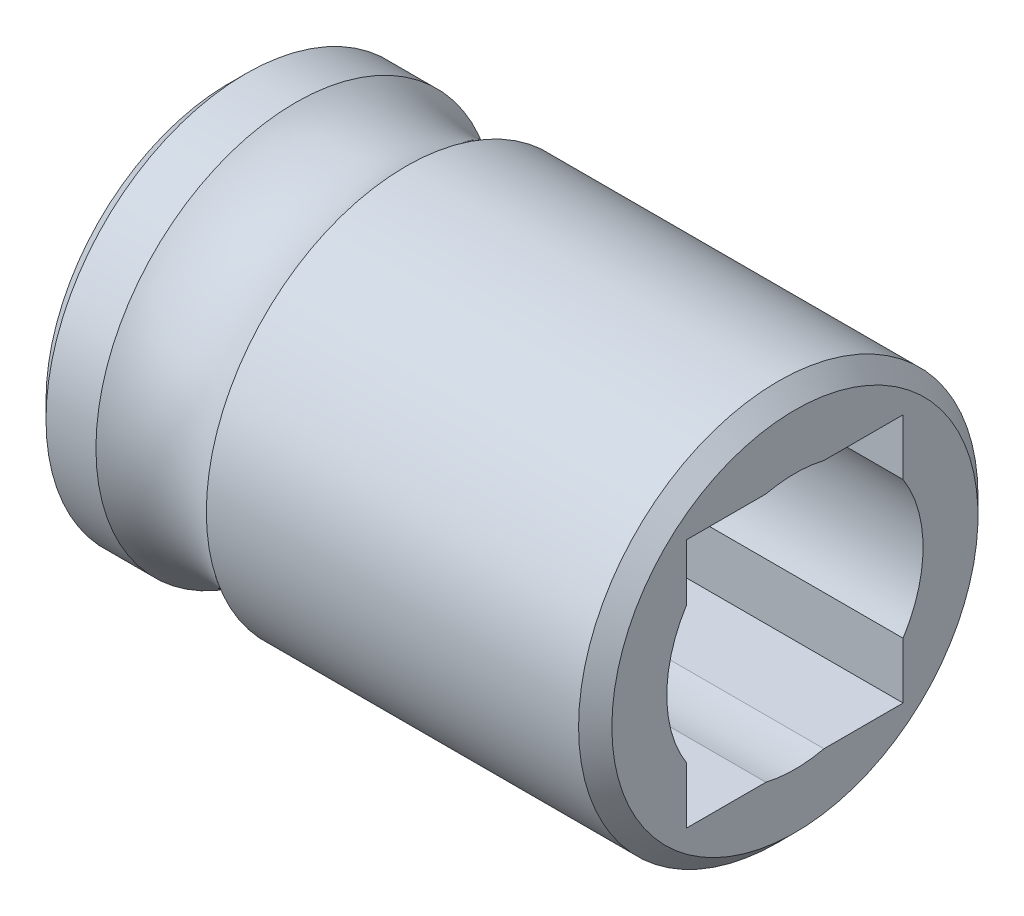
ISO-10303-21;
HEADER;
FILE_DESCRIPTION(('STEP AP214'),'2;1');
FILE_NAME('part.step','',(''),(''),'','','');
FILE_SCHEMA(('AUTOMOTIVE_DESIGN { 1 0 10303 214 1 1 1 1 }'));
ENDSEC;
DATA;
#1=APPLICATION_CONTEXT('core data for automotive mechanical design processes');
#2=APPLICATION_PROTOCOL_DEFINITION('international standard','automotive_design',2000,#1);
#3=PRODUCT_CONTEXT('',#1,'mechanical');
#4=PRODUCT('Part','Part','',(#3));
#5=PRODUCT_RELATED_PRODUCT_CATEGORY('part','',(#4));
#6=PRODUCT_DEFINITION_FORMATION('','',#4);
#7=PRODUCT_DEFINITION_CONTEXT('part definition',#1,'design');
#8=PRODUCT_DEFINITION('design','',#6,#7);
#9=PRODUCT_DEFINITION_SHAPE('','',#8);
#10=(LENGTH_UNIT() NAMED_UNIT(*) SI_UNIT(.MILLI.,.METRE.));
#11=(NAMED_UNIT(*) PLANE_ANGLE_UNIT() SI_UNIT($,.RADIAN.));
#12=(NAMED_UNIT(*) SI_UNIT($,.STERADIAN.) SOLID_ANGLE_UNIT());
#13=UNCERTAINTY_MEASURE_WITH_UNIT(LENGTH_MEASURE(1.E-05),#10,'distance_accuracy_value','');
#14=(GEOMETRIC_REPRESENTATION_CONTEXT(3) GLOBAL_UNCERTAINTY_ASSIGNED_CONTEXT((#13)) GLOBAL_UNIT_ASSIGNED_CONTEXT((#10,
#11,#12)) REPRESENTATION_CONTEXT('',''));
#15=CARTESIAN_POINT('',(0.,0.,0.));
#16=DIRECTION('',(0.,0.,1.));
#17=DIRECTION('',(1.,0.,0.));
#18=AXIS2_PLACEMENT_3D('',#15,#16,#17);
#19=CARTESIAN_POINT('',(-34.7505494505494,0.,0.));
#20=DIRECTION('',(-1.,0.,0.));
#21=DIRECTION('',(0.,0.,1.));
#22=AXIS2_PLACEMENT_3D('',#19,#20,#21);
#23=CYLINDRICAL_SURFACE('',#22,3.85);
#24=CARTESIAN_POINT('',(-17.,0.,0.));
#25=DIRECTION('',(-1.,0.,0.));
#26=DIRECTION('',(0.,0.,1.));
#27=AXIS2_PLACEMENT_3D('',#24,#25,#26);
#28=CIRCLE('',#27,3.85);
#29=CARTESIAN_POINT('',(-17.,-2.06397674405503,3.25));
#30=VERTEX_POINT('',#29);
#31=CARTESIAN_POINT('',(-17.,2.06397674405503,3.25));
#32=VERTEX_POINT('',#31);
#33=EDGE_CURVE('E509',#30,#32,#28,.T.);
#34=ORIENTED_EDGE('',*,*,#33,.T.);
#35=DIRECTION('',(-1.,0.,0.));
#36=VECTOR('',#35,1.);
#37=CARTESIAN_POINT('',(-34.7505494505494,2.06397674405503,3.25));
#38=LINE('',#37,#36);
#39=CARTESIAN_POINT('',(0.,2.06397674405503,3.25));
#40=VERTEX_POINT('',#39);
#41=EDGE_CURVE('E506',#32,#40,#38,.F.);
#42=ORIENTED_EDGE('',*,*,#41,.T.);
#43=CARTESIAN_POINT('',(0.,0.,0.));
#44=DIRECTION('',(-1.,0.,0.));
#45=DIRECTION('',(0.,0.,1.));
#46=AXIS2_PLACEMENT_3D('',#43,#44,#45);
#47=CIRCLE('',#46,3.85);
#48=CARTESIAN_POINT('',(0.,-2.06397674405503,3.25));
#49=VERTEX_POINT('',#48);
#50=EDGE_CURVE('E532',#49,#40,#47,.T.);
#51=ORIENTED_EDGE('',*,*,#50,.F.);
#52=DIRECTION('',(-1.,0.,0.));
#53=VECTOR('',#52,1.);
#54=CARTESIAN_POINT('',(-34.7505494505494,-2.06397674405503,3.25));
#55=LINE('',#54,#53);
#56=EDGE_CURVE('E446',#49,#30,#55,.T.);
#57=ORIENTED_EDGE('',*,*,#56,.T.);
#58=EDGE_LOOP('',(#34,#42,#51,#57));
#59=FACE_BOUND('',#58,.T.);
#60=ADVANCED_FACE('F350',(#59),#23,.F.);
#61=CARTESIAN_POINT('',(-17.,3.75,0.871779788708133));
#62=VERTEX_POINT('',#61);
#63=CARTESIAN_POINT('',(-17.,3.75,-0.871779788708131));
#64=VERTEX_POINT('',#63);
#65=EDGE_CURVE('E513',#62,#64,#28,.T.);
#66=ORIENTED_EDGE('',*,*,#65,.T.);
#67=DIRECTION('',(-1.,0.,0.));
#68=VECTOR('',#67,1.);
#69=CARTESIAN_POINT('',(-34.7505494505494,3.75,-0.871779788708133));
#70=LINE('',#69,#68);
#71=CARTESIAN_POINT('',(0.,3.75,-0.871779788708131));
#72=VERTEX_POINT('',#71);
#73=EDGE_CURVE('E502',#64,#72,#70,.F.);
#74=ORIENTED_EDGE('',*,*,#73,.T.);
#75=CARTESIAN_POINT('',(0.,3.75,0.871779788708133));
#76=VERTEX_POINT('',#75);
#77=EDGE_CURVE('E534',#76,#72,#47,.T.);
#78=ORIENTED_EDGE('',*,*,#77,.F.);
#79=DIRECTION('',(-1.,0.,0.));
#80=VECTOR('',#79,1.);
#81=CARTESIAN_POINT('',(-34.7505494505494,3.75,0.871779788708132));
#82=LINE('',#81,#80);
#83=EDGE_CURVE('E499',#76,#62,#82,.T.);
#84=ORIENTED_EDGE('',*,*,#83,.T.);
#85=EDGE_LOOP('',(#66,#74,#78,#84));
#86=FACE_BOUND('',#85,.T.);
#87=ADVANCED_FACE('F573',(#86),#23,.F.);
#88=CARTESIAN_POINT('',(-17.,2.06397674405503,-3.25));
#89=VERTEX_POINT('',#88);
#90=CARTESIAN_POINT('',(-17.,-2.06397674405503,-3.25));
#91=VERTEX_POINT('',#90);
#92=EDGE_CURVE('E557',#89,#91,#28,.T.);
#93=ORIENTED_EDGE('',*,*,#92,.T.);
#94=DIRECTION('',(-1.,0.,0.));
#95=VECTOR('',#94,1.);
#96=CARTESIAN_POINT('',(-34.7505494505494,-2.06397674405503,-3.25));
#97=LINE('',#96,#95);
#98=CARTESIAN_POINT('',(0.,-2.06397674405503,-3.25));
#99=VERTEX_POINT('',#98);
#100=EDGE_CURVE('E496',#91,#99,#97,.F.);
#101=ORIENTED_EDGE('',*,*,#100,.T.);
#102=CARTESIAN_POINT('',(0.,2.06397674405503,-3.25));
#103=VERTEX_POINT('',#102);
#104=EDGE_CURVE('E571',#103,#99,#47,.T.);
#105=ORIENTED_EDGE('',*,*,#104,.F.);
#106=DIRECTION('',(-1.,0.,0.));
#107=VECTOR('',#106,1.);
#108=CARTESIAN_POINT('',(-34.7505494505494,2.06397674405503,-3.25));
#109=LINE('',#108,#107);
#110=EDGE_CURVE('E493',#103,#89,#109,.T.);
#111=ORIENTED_EDGE('',*,*,#110,.T.);
#112=EDGE_LOOP('',(#93,#101,#105,#111));
#113=FACE_BOUND('',#112,.T.);
#114=ADVANCED_FACE('F577',(#113),#23,.F.);
#115=CARTESIAN_POINT('',(-17.,-3.75,-0.871779788708135));
#116=VERTEX_POINT('',#115);
#117=CARTESIAN_POINT('',(-17.,-3.75,0.871779788708135));
#118=VERTEX_POINT('',#117);
#119=EDGE_CURVE('E512',#116,#118,#28,.T.);
#120=ORIENTED_EDGE('',*,*,#119,.T.);
#121=DIRECTION('',(-1.,0.,0.));
#122=VECTOR('',#121,1.);
#123=CARTESIAN_POINT('',(-34.7505494505494,-3.75,0.871779788708137));
#124=LINE('',#123,#122);
#125=CARTESIAN_POINT('',(0.,-3.75,0.871779788708139));
#126=VERTEX_POINT('',#125);
#127=EDGE_CURVE('E491',#118,#126,#124,.F.);
#128=ORIENTED_EDGE('',*,*,#127,.T.);
#129=CARTESIAN_POINT('',(0.,-3.75,-0.87177978870814));
#130=VERTEX_POINT('',#129);
#131=EDGE_CURVE('E466',#130,#126,#47,.T.);
#132=ORIENTED_EDGE('',*,*,#131,.F.);
#133=DIRECTION('',(-1.,0.,0.));
#134=VECTOR('',#133,1.);
#135=CARTESIAN_POINT('',(-34.7505494505494,-3.75,-0.871779788708137));
#136=LINE('',#135,#134);
#137=EDGE_CURVE('E484',#130,#116,#136,.T.);
#138=ORIENTED_EDGE('',*,*,#137,.T.);
#139=EDGE_LOOP('',(#120,#128,#132,#138));
#140=FACE_BOUND('',#139,.T.);
#141=ADVANCED_FACE('F352',(#140),#23,.F.);
#142=CARTESIAN_POINT('',(0.,3.85,0.));
#143=DIRECTION('',(-1.,0.,0.));
#144=DIRECTION('',(0.,0.,1.));
#145=AXIS2_PLACEMENT_3D('',#142,#143,#144);
#146=PLANE('',#145);
#147=CARTESIAN_POINT('',(0.,0.,0.));
#148=DIRECTION('',(-1.,0.,0.));
#149=DIRECTION('',(0.,0.,1.));
#150=AXIS2_PLACEMENT_3D('',#147,#148,#149);
#151=CIRCLE('',#150,5.5);
#152=CARTESIAN_POINT('',(0.,0.,5.5));
#153=VERTEX_POINT('',#152);
#154=EDGE_CURVE('E529',#153,#153,#151,.T.);
#155=ORIENTED_EDGE('',*,*,#154,.F.);
#156=EDGE_LOOP('',(#155));
#157=FACE_BOUND('',#156,.T.);
#158=ORIENTED_EDGE('',*,*,#50,.T.);
#159=DIRECTION('',(0.,-1.,0.));
#160=VECTOR('',#159,1.);
#161=CARTESIAN_POINT('',(0.,-3.75,3.25));
#162=LINE('',#161,#160);
#163=CARTESIAN_POINT('',(0.,3.75,3.25));
#164=VERTEX_POINT('',#163);
#165=EDGE_CURVE('E451',#164,#40,#162,.T.);
#166=ORIENTED_EDGE('',*,*,#165,.F.);
#167=DIRECTION('',(0.,0.,1.));
#168=VECTOR('',#167,1.);
#169=CARTESIAN_POINT('',(0.,3.75,3.25));
#170=LINE('',#169,#168);
#171=EDGE_CURVE('E473',#76,#164,#170,.T.);
#172=ORIENTED_EDGE('',*,*,#171,.F.);
#173=ORIENTED_EDGE('',*,*,#77,.T.);
#174=CARTESIAN_POINT('',(0.,3.75,-3.25));
#175=VERTEX_POINT('',#174);
#176=EDGE_CURVE('E474',#175,#72,#170,.T.);
#177=ORIENTED_EDGE('',*,*,#176,.F.);
#178=DIRECTION('',(0.,1.,0.));
#179=VECTOR('',#178,1.);
#180=CARTESIAN_POINT('',(0.,-3.75,-3.25));
#181=LINE('',#180,#179);
#182=EDGE_CURVE('E467',#103,#175,#181,.T.);
#183=ORIENTED_EDGE('',*,*,#182,.F.);
#184=ORIENTED_EDGE('',*,*,#104,.T.);
#185=CARTESIAN_POINT('',(0.,-3.75,-3.25));
#186=VERTEX_POINT('',#185);
#187=EDGE_CURVE('E470',#186,#99,#181,.T.);
#188=ORIENTED_EDGE('',*,*,#187,.F.);
#189=DIRECTION('',(0.,0.,-1.));
#190=VECTOR('',#189,1.);
#191=CARTESIAN_POINT('',(0.,-3.75,3.25));
#192=LINE('',#191,#190);
#193=EDGE_CURVE('E468',#130,#186,#192,.T.);
#194=ORIENTED_EDGE('',*,*,#193,.F.);
#195=ORIENTED_EDGE('',*,*,#131,.T.);
#196=CARTESIAN_POINT('',(0.,-3.75,3.25));
#197=VERTEX_POINT('',#196);
#198=EDGE_CURVE('E455',#197,#126,#192,.T.);
#199=ORIENTED_EDGE('',*,*,#198,.F.);
#200=EDGE_CURVE('E440',#49,#197,#162,.T.);
#201=ORIENTED_EDGE('',*,*,#200,.F.);
#202=EDGE_LOOP('',(#158,#166,#172,#173,#177,#183,#184,#188,#194,#195,#199,#201));
#203=FACE_BOUND('',#202,.T.);
#204=ADVANCED_FACE('F463',(#157,#203),#146,.F.);
#205=CARTESIAN_POINT('',(0.,0.,0.));
#206=DIRECTION('',(-1.,0.,0.));
#207=DIRECTION('',(0.,0.,1.));
#208=AXIS2_PLACEMENT_3D('',#205,#206,#207);
#209=CONICAL_SURFACE('',#208,5.5,0.785398163397448);
#210=CARTESIAN_POINT('',(-0.5,0.,0.));
#211=DIRECTION('',(-1.,0.,0.));
#212=DIRECTION('',(0.,0.,1.));
#213=AXIS2_PLACEMENT_3D('',#210,#211,#212);
#214=CIRCLE('',#213,6.);
#215=CARTESIAN_POINT('',(-0.5,0.,6.));
#216=VERTEX_POINT('',#215);
#217=EDGE_CURVE('E526',#216,#216,#214,.T.);
#218=ORIENTED_EDGE('',*,*,#217,.F.);
#219=EDGE_LOOP('',(#218));
#220=FACE_BOUND('',#219,.T.);
#221=ORIENTED_EDGE('',*,*,#154,.T.);
#222=EDGE_LOOP('',(#221));
#223=FACE_BOUND('',#222,.T.);
#224=ADVANCED_FACE('F633',(#220,#223),#209,.T.);
#225=CARTESIAN_POINT('',(-34.7505494505494,0.,0.));
#226=DIRECTION('',(-1.,0.,0.));
#227=DIRECTION('',(0.,0.,1.));
#228=AXIS2_PLACEMENT_3D('',#225,#226,#227);
#229=CYLINDRICAL_SURFACE('',#228,6.);
#230=CARTESIAN_POINT('',(-11.6833752096446,0.,0.));
#231=DIRECTION('',(-1.,0.,0.));
#232=DIRECTION('',(0.,0.,1.));
#233=AXIS2_PLACEMENT_3D('',#230,#231,#232);
#234=CIRCLE('',#233,6.);
#235=CARTESIAN_POINT('',(-11.6833752096446,0.,6.));
#236=VERTEX_POINT('',#235);
#237=EDGE_CURVE('E523',#236,#236,#234,.T.);
#238=ORIENTED_EDGE('',*,*,#237,.F.);
#239=EDGE_LOOP('',(#238));
#240=FACE_BOUND('',#239,.T.);
#241=ORIENTED_EDGE('',*,*,#217,.T.);
#242=EDGE_LOOP('',(#241));
#243=FACE_BOUND('',#242,.T.);
#244=ADVANCED_FACE('F625',(#240,#243),#229,.T.);
#245=CARTESIAN_POINT('',(-13.3416876048223,0.,0.));
#246=DIRECTION('',(-1.,0.,0.));
#247=DIRECTION('',(0.,0.,1.));
#248=AXIS2_PLACEMENT_3D('',#245,#246,#247);
#249=TOROIDAL_SURFACE('',#248,8.5,3.);
#250=CARTESIAN_POINT('',(-15.,0.,0.));
#251=DIRECTION('',(-1.,0.,0.));
#252=DIRECTION('',(0.,0.,1.));
#253=AXIS2_PLACEMENT_3D('',#250,#251,#252);
#254=CIRCLE('',#253,6.);
#255=CARTESIAN_POINT('',(-15.,0.,6.));
#256=VERTEX_POINT('',#255);
#257=EDGE_CURVE('E520',#256,#256,#254,.T.);
#258=ORIENTED_EDGE('',*,*,#257,.F.);
#259=EDGE_LOOP('',(#258));
#260=FACE_BOUND('',#259,.T.);
#261=ORIENTED_EDGE('',*,*,#237,.T.);
#262=EDGE_LOOP('',(#261));
#263=FACE_BOUND('',#262,.T.);
#264=ADVANCED_FACE('F617',(#260,#263),#249,.F.);
#265=CARTESIAN_POINT('',(-34.7505494505494,0.,0.));
#266=DIRECTION('',(-1.,0.,0.));
#267=DIRECTION('',(0.,0.,1.));
#268=AXIS2_PLACEMENT_3D('',#265,#266,#267);
#269=CYLINDRICAL_SURFACE('',#268,6.);
#270=CARTESIAN_POINT('',(-16.5,0.,0.));
#271=DIRECTION('',(-1.,0.,0.));
#272=DIRECTION('',(0.,0.,1.));
#273=AXIS2_PLACEMENT_3D('',#270,#271,#272);
#274=CIRCLE('',#273,6.);
#275=CARTESIAN_POINT('',(-16.5,0.,6.));
#276=VERTEX_POINT('',#275);
#277=EDGE_CURVE('E517',#276,#276,#274,.T.);
#278=ORIENTED_EDGE('',*,*,#277,.F.);
#279=EDGE_LOOP('',(#278));
#280=FACE_BOUND('',#279,.T.);
#281=ORIENTED_EDGE('',*,*,#257,.T.);
#282=EDGE_LOOP('',(#281));
#283=FACE_BOUND('',#282,.T.);
#284=ADVANCED_FACE('F611',(#280,#283),#269,.T.);
#285=CARTESIAN_POINT('',(-16.5,0.,0.));
#286=DIRECTION('',(1.,0.,0.));
#287=DIRECTION('',(0.,0.,-1.));
#288=AXIS2_PLACEMENT_3D('',#285,#286,#287);
#289=CONICAL_SURFACE('',#288,6.,0.785398163397448);
#290=CARTESIAN_POINT('',(-17.,0.,0.));
#291=DIRECTION('',(-1.,0.,0.));
#292=DIRECTION('',(0.,0.,1.));
#293=AXIS2_PLACEMENT_3D('',#290,#291,#292);
#294=CIRCLE('',#293,5.5);
#295=CARTESIAN_POINT('',(-17.,0.,5.5));
#296=VERTEX_POINT('',#295);
#297=EDGE_CURVE('E514',#296,#296,#294,.T.);
#298=ORIENTED_EDGE('',*,*,#297,.F.);
#299=EDGE_LOOP('',(#298));
#300=FACE_BOUND('',#299,.T.);
#301=ORIENTED_EDGE('',*,*,#277,.T.);
#302=EDGE_LOOP('',(#301));
#303=FACE_BOUND('',#302,.T.);
#304=ADVANCED_FACE('F591',(#300,#303),#289,.T.);
#305=CARTESIAN_POINT('',(-17.,5.5,0.));
#306=DIRECTION('',(1.,0.,0.));
#307=DIRECTION('',(0.,0.,-1.));
#308=AXIS2_PLACEMENT_3D('',#305,#306,#307);
#309=PLANE('',#308);
#310=DIRECTION('',(0.,0.,1.));
#311=VECTOR('',#310,1.);
#312=CARTESIAN_POINT('',(-17.,3.75,0.));
#313=LINE('',#312,#311);
#314=CARTESIAN_POINT('',(-17.,3.75,3.25));
#315=VERTEX_POINT('',#314);
#316=EDGE_CURVE('E11',#62,#315,#313,.T.);
#317=ORIENTED_EDGE('',*,*,#316,.T.);
#318=DIRECTION('',(0.,-1.,0.));
#319=VECTOR('',#318,1.);
#320=CARTESIAN_POINT('',(-17.,-3.75,3.25));
#321=LINE('',#320,#319);
#322=EDGE_CURVE('E365',#315,#32,#321,.T.);
#323=ORIENTED_EDGE('',*,*,#322,.T.);
#324=ORIENTED_EDGE('',*,*,#33,.F.);
#325=DIRECTION('',(0.,-1.,0.));
#326=VECTOR('',#325,1.);
#327=CARTESIAN_POINT('',(-17.,5.5,3.25));
#328=LINE('',#327,#326);
#329=CARTESIAN_POINT('',(-17.,-3.75,3.25));
#330=VERTEX_POINT('',#329);
#331=EDGE_CURVE('E538',#30,#330,#328,.T.);
#332=ORIENTED_EDGE('',*,*,#331,.T.);
#333=DIRECTION('',(0.,0.,-1.));
#334=VECTOR('',#333,1.);
#335=CARTESIAN_POINT('',(-17.,-3.75,3.25));
#336=LINE('',#335,#334);
#337=EDGE_CURVE('E458',#330,#118,#336,.T.);
#338=ORIENTED_EDGE('',*,*,#337,.T.);
#339=ORIENTED_EDGE('',*,*,#119,.F.);
#340=DIRECTION('',(0.,0.,-1.));
#341=VECTOR('',#340,1.);
#342=CARTESIAN_POINT('',(-17.,-3.75,0.));
#343=LINE('',#342,#341);
#344=CARTESIAN_POINT('',(-17.,-3.75,-3.25));
#345=VERTEX_POINT('',#344);
#346=EDGE_CURVE('E535',#116,#345,#343,.T.);
#347=ORIENTED_EDGE('',*,*,#346,.T.);
#348=DIRECTION('',(0.,1.,0.));
#349=VECTOR('',#348,1.);
#350=CARTESIAN_POINT('',(-17.,-3.75,-3.25));
#351=LINE('',#350,#349);
#352=EDGE_CURVE('E478',#345,#91,#351,.T.);
#353=ORIENTED_EDGE('',*,*,#352,.T.);
#354=ORIENTED_EDGE('',*,*,#92,.F.);
#355=DIRECTION('',(0.,1.,0.));
#356=VECTOR('',#355,1.);
#357=CARTESIAN_POINT('',(-17.,5.5,-3.25));
#358=LINE('',#357,#356);
#359=CARTESIAN_POINT('',(-17.,3.75,-3.25));
#360=VERTEX_POINT('',#359);
#361=EDGE_CURVE('E358',#89,#360,#358,.T.);
#362=ORIENTED_EDGE('',*,*,#361,.T.);
#363=DIRECTION('',(0.,0.,1.));
#364=VECTOR('',#363,1.);
#365=CARTESIAN_POINT('',(-17.,3.75,3.25));
#366=LINE('',#365,#364);
#367=EDGE_CURVE('E373',#360,#64,#366,.T.);
#368=ORIENTED_EDGE('',*,*,#367,.T.);
#369=ORIENTED_EDGE('',*,*,#65,.F.);
#370=EDGE_LOOP('',(#317,#323,#324,#332,#338,#339,#347,#353,#354,#362,#368,#369));
#371=FACE_BOUND('',#370,.T.);
#372=ORIENTED_EDGE('',*,*,#297,.T.);
#373=EDGE_LOOP('',(#372));
#374=FACE_BOUND('',#373,.T.);
#375=ADVANCED_FACE('F542',(#371,#374),#309,.F.);
#376=CARTESIAN_POINT('',(-17.,-3.75,3.25));
#377=DIRECTION('',(0.,-1.,0.));
#378=DIRECTION('',(0.,0.,-1.));
#379=AXIS2_PLACEMENT_3D('',#376,#377,#378);
#380=PLANE('',#379);
#381=ORIENTED_EDGE('',*,*,#193,.T.);
#382=DIRECTION('',(1.,0.,0.));
#383=VECTOR('',#382,1.);
#384=CARTESIAN_POINT('',(-17.,-3.75,-3.25));
#385=LINE('',#384,#383);
#386=EDGE_CURVE('E460',#345,#186,#385,.T.);
#387=ORIENTED_EDGE('',*,*,#386,.F.);
#388=ORIENTED_EDGE('',*,*,#346,.F.);
#389=ORIENTED_EDGE('',*,*,#137,.F.);
#390=EDGE_LOOP('',(#381,#387,#388,#389));
#391=FACE_BOUND('',#390,.T.);
#392=ADVANCED_FACE('F564',(#391),#380,.F.);
#393=CARTESIAN_POINT('',(-17.,-3.75,-3.25));
#394=DIRECTION('',(0.,0.,-1.));
#395=DIRECTION('',(0.,1.,0.));
#396=AXIS2_PLACEMENT_3D('',#393,#394,#395);
#397=PLANE('',#396);
#398=ORIENTED_EDGE('',*,*,#352,.F.);
#399=ORIENTED_EDGE('',*,*,#386,.T.);
#400=ORIENTED_EDGE('',*,*,#187,.T.);
#401=ORIENTED_EDGE('',*,*,#100,.F.);
#402=EDGE_LOOP('',(#398,#399,#400,#401));
#403=FACE_BOUND('',#402,.T.);
#404=ADVANCED_FACE('F567',(#403),#397,.F.);
#405=ORIENTED_EDGE('',*,*,#337,.F.);
#406=DIRECTION('',(1.,0.,0.));
#407=VECTOR('',#406,1.);
#408=CARTESIAN_POINT('',(-17.,-3.75,3.25));
#409=LINE('',#408,#407);
#410=EDGE_CURVE('E443',#330,#197,#409,.T.);
#411=ORIENTED_EDGE('',*,*,#410,.T.);
#412=ORIENTED_EDGE('',*,*,#198,.T.);
#413=ORIENTED_EDGE('',*,*,#127,.F.);
#414=EDGE_LOOP('',(#405,#411,#412,#413));
#415=FACE_BOUND('',#414,.T.);
#416=ADVANCED_FACE('F454',(#415),#380,.F.);
#417=CARTESIAN_POINT('',(-17.,-3.75,3.25));
#418=DIRECTION('',(0.,0.,1.));
#419=DIRECTION('',(0.,-1.,0.));
#420=AXIS2_PLACEMENT_3D('',#417,#418,#419);
#421=PLANE('',#420);
#422=ORIENTED_EDGE('',*,*,#200,.T.);
#423=ORIENTED_EDGE('',*,*,#410,.F.);
#424=ORIENTED_EDGE('',*,*,#331,.F.);
#425=ORIENTED_EDGE('',*,*,#56,.F.);
#426=EDGE_LOOP('',(#422,#423,#424,#425));
#427=FACE_BOUND('',#426,.T.);
#428=ADVANCED_FACE('F442',(#427),#421,.F.);
#429=ORIENTED_EDGE('',*,*,#182,.T.);
#430=DIRECTION('',(1.,0.,0.));
#431=VECTOR('',#430,1.);
#432=CARTESIAN_POINT('',(-17.,3.75,-3.25));
#433=LINE('',#432,#431);
#434=EDGE_CURVE('E485',#360,#175,#433,.T.);
#435=ORIENTED_EDGE('',*,*,#434,.F.);
#436=ORIENTED_EDGE('',*,*,#361,.F.);
#437=ORIENTED_EDGE('',*,*,#110,.F.);
#438=EDGE_LOOP('',(#429,#435,#436,#437));
#439=FACE_BOUND('',#438,.T.);
#440=ADVANCED_FACE('F576',(#439),#397,.F.);
#441=CARTESIAN_POINT('',(-17.,3.75,3.25));
#442=DIRECTION('',(0.,1.,0.));
#443=DIRECTION('',(0.,0.,1.));
#444=AXIS2_PLACEMENT_3D('',#441,#442,#443);
#445=PLANE('',#444);
#446=ORIENTED_EDGE('',*,*,#367,.F.);
#447=ORIENTED_EDGE('',*,*,#434,.T.);
#448=ORIENTED_EDGE('',*,*,#176,.T.);
#449=ORIENTED_EDGE('',*,*,#73,.F.);
#450=EDGE_LOOP('',(#446,#447,#448,#449));
#451=FACE_BOUND('',#450,.T.);
#452=ADVANCED_FACE('F574',(#451),#445,.F.);
#453=ORIENTED_EDGE('',*,*,#322,.F.);
#454=DIRECTION('',(1.,0.,0.));
#455=VECTOR('',#454,1.);
#456=CARTESIAN_POINT('',(-17.,3.75,3.25));
#457=LINE('',#456,#455);
#458=EDGE_CURVE('E482',#315,#164,#457,.T.);
#459=ORIENTED_EDGE('',*,*,#458,.T.);
#460=ORIENTED_EDGE('',*,*,#165,.T.);
#461=ORIENTED_EDGE('',*,*,#41,.F.);
#462=EDGE_LOOP('',(#453,#459,#460,#461));
#463=FACE_BOUND('',#462,.T.);
#464=ADVANCED_FACE('F551',(#463),#421,.F.);
#465=ORIENTED_EDGE('',*,*,#171,.T.);
#466=ORIENTED_EDGE('',*,*,#458,.F.);
#467=ORIENTED_EDGE('',*,*,#316,.F.);
#468=ORIENTED_EDGE('',*,*,#83,.F.);
#469=EDGE_LOOP('',(#465,#466,#467,#468));
#470=FACE_BOUND('',#469,.T.);
#471=ADVANCED_FACE('F553',(#470),#445,.F.);
#472=CLOSED_SHELL('',(#60,#87,#114,#141,#204,#224,#244,#264,#284,#304,#375,#392,#404,#416,#428,
#440,#452,#464,#471));
#473=MANIFOLD_SOLID_BREP('B2',#472);
#474=ADVANCED_BREP_SHAPE_REPRESENTATION('',(#18,#473),#14);
#475=SHAPE_DEFINITION_REPRESENTATION(#9,#474);
ENDSEC;
END-ISO-10303-21;
